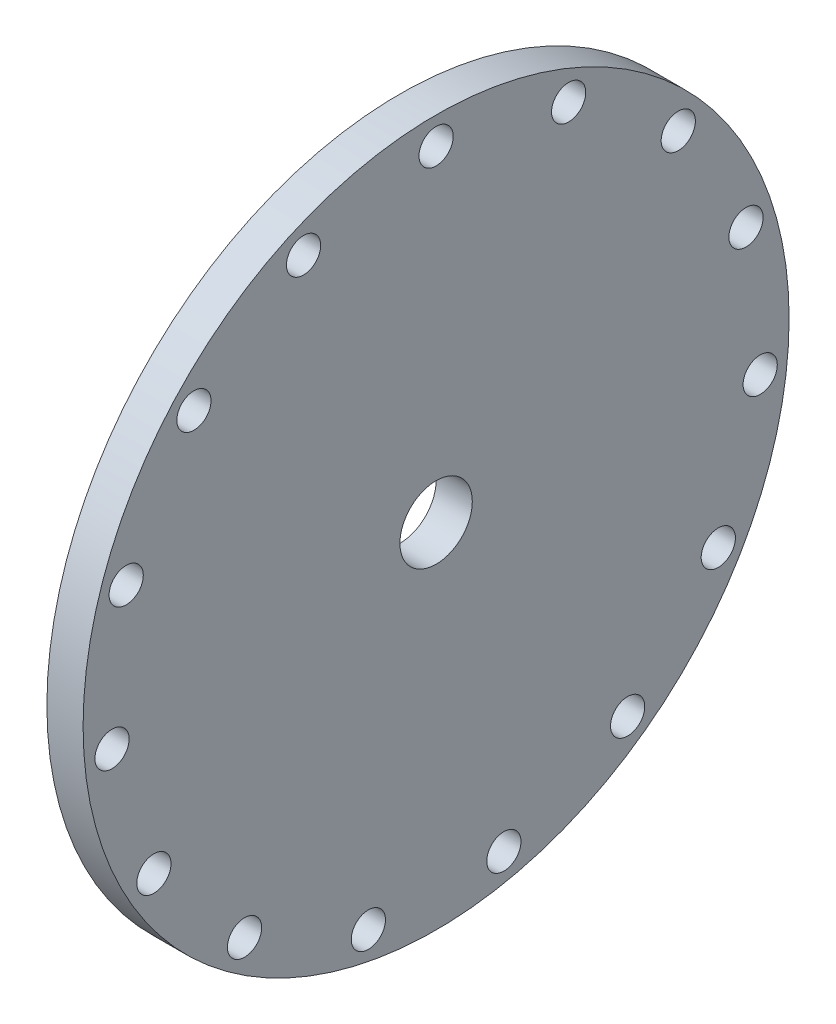
ISO-10303-21;
HEADER;
FILE_DESCRIPTION(('STEP AP214'),'2;1');
FILE_NAME('part.step','',(''),(''),'','','');
FILE_SCHEMA(('AUTOMOTIVE_DESIGN { 1 0 10303 214 1 1 1 1 }'));
ENDSEC;
DATA;
#1=APPLICATION_CONTEXT('core data for automotive mechanical design processes');
#2=APPLICATION_PROTOCOL_DEFINITION('international standard','automotive_design',2000,#1);
#3=PRODUCT_CONTEXT('',#1,'mechanical');
#4=PRODUCT('Part','Part','',(#3));
#5=PRODUCT_RELATED_PRODUCT_CATEGORY('part','',(#4));
#6=PRODUCT_DEFINITION_FORMATION('','',#4);
#7=PRODUCT_DEFINITION_CONTEXT('part definition',#1,'design');
#8=PRODUCT_DEFINITION('design','',#6,#7);
#9=PRODUCT_DEFINITION_SHAPE('','',#8);
#10=(LENGTH_UNIT() NAMED_UNIT(*) SI_UNIT(.MILLI.,.METRE.));
#11=(NAMED_UNIT(*) PLANE_ANGLE_UNIT() SI_UNIT($,.RADIAN.));
#12=(NAMED_UNIT(*) SI_UNIT($,.STERADIAN.) SOLID_ANGLE_UNIT());
#13=UNCERTAINTY_MEASURE_WITH_UNIT(LENGTH_MEASURE(1.E-05),#10,'distance_accuracy_value','');
#14=(GEOMETRIC_REPRESENTATION_CONTEXT(3) GLOBAL_UNCERTAINTY_ASSIGNED_CONTEXT((#13)) GLOBAL_UNIT_ASSIGNED_CONTEXT((#10,
#11,#12)) REPRESENTATION_CONTEXT('',''));
#15=CARTESIAN_POINT('',(0.,0.,0.));
#16=DIRECTION('',(0.,0.,1.));
#17=DIRECTION('',(1.,0.,0.));
#18=AXIS2_PLACEMENT_3D('',#15,#16,#17);
#19=CARTESIAN_POINT('',(3.175,0.,0.));
#20=DIRECTION('',(1.,0.,0.));
#21=DIRECTION('',(0.,0.,-1.));
#22=AXIS2_PLACEMENT_3D('',#19,#20,#21);
#23=PLANE('',#22);
#24=CARTESIAN_POINT('',(3.175,0.,0.));
#25=DIRECTION('',(1.,0.,0.));
#26=DIRECTION('',(0.,0.,-1.));
#27=AXIS2_PLACEMENT_3D('',#24,#25,#26);
#28=CIRCLE('',#27,3.175);
#29=CARTESIAN_POINT('',(3.175,0.,-3.175));
#30=VERTEX_POINT('',#29);
#31=EDGE_CURVE('E150',#30,#30,#28,.T.);
#32=ORIENTED_EDGE('',*,*,#31,.F.);
#33=EDGE_LOOP('',(#32));
#34=FACE_BOUND('',#33,.T.);
#35=CARTESIAN_POINT('',(3.175,19.1204070767037,21.2353633880166));
#36=DIRECTION('',(1.,0.,0.));
#37=DIRECTION('',(0.,0.,-1.));
#38=AXIS2_PLACEMENT_3D('',#35,#36,#37);
#39=CIRCLE('',#38,1.5);
#40=CARTESIAN_POINT('',(3.175,19.1204070767037,19.7353633880166));
#41=VERTEX_POINT('',#40);
#42=EDGE_CURVE('E135',#41,#41,#39,.T.);
#43=ORIENTED_EDGE('',*,*,#42,.F.);
#44=EDGE_LOOP('',(#43));
#45=FACE_BOUND('',#44,.T.);
#46=CARTESIAN_POINT('',(3.175,-2.98690083787389,28.4184631601482));
#47=DIRECTION('',(1.,0.,0.));
#48=DIRECTION('',(0.,0.,-1.));
#49=AXIS2_PLACEMENT_3D('',#46,#47,#48);
#50=CIRCLE('',#49,1.5);
#51=CARTESIAN_POINT('',(3.175,-2.98690083787389,26.9184631601482));
#52=VERTEX_POINT('',#51);
#53=EDGE_CURVE('E123',#52,#52,#50,.T.);
#54=ORIENTED_EDGE('',*,*,#53,.F.);
#55=EDGE_LOOP('',(#54));
#56=FACE_BOUND('',#55,.T.);
#57=CARTESIAN_POINT('',(3.175,-27.9505676909686,5.94107656511645));
#58=DIRECTION('',(1.,0.,0.));
#59=DIRECTION('',(0.,0.,-1.));
#60=AXIS2_PLACEMENT_3D('',#57,#58,#59);
#61=CIRCLE('',#60,1.5);
#62=CARTESIAN_POINT('',(3.175,-27.9505676909686,4.44107656511645));
#63=VERTEX_POINT('',#62);
#64=EDGE_CURVE('E111',#63,#63,#61,.T.);
#65=ORIENTED_EDGE('',*,*,#64,.F.);
#66=EDGE_LOOP('',(#65));
#67=FACE_BOUND('',#66,.T.);
#68=CARTESIAN_POINT('',(3.175,-23.1176606142638,-16.7959635842584));
#69=DIRECTION('',(1.,0.,0.));
#70=DIRECTION('',(0.,0.,-1.));
#71=AXIS2_PLACEMENT_3D('',#68,#69,#70);
#72=CIRCLE('',#71,1.5);
#73=CARTESIAN_POINT('',(3.175,-23.1176606142638,-18.2959635842584));
#74=VERTEX_POINT('',#73);
#75=EDGE_CURVE('E99',#74,#74,#72,.T.);
#76=ORIENTED_EDGE('',*,*,#75,.F.);
#77=EDGE_LOOP('',(#76));
#78=FACE_BOUND('',#77,.T.);
#79=CARTESIAN_POINT('',(3.175,-2.98690083787268,-28.418463160149));
#80=DIRECTION('',(1.,0.,0.));
#81=DIRECTION('',(0.,0.,-1.));
#82=AXIS2_PLACEMENT_3D('',#79,#80,#81);
#83=CIRCLE('',#82,1.5);
#84=CARTESIAN_POINT('',(3.175,-2.98690083787268,-29.918463160149));
#85=VERTEX_POINT('',#84);
#86=EDGE_CURVE('E87',#85,#85,#83,.T.);
#87=ORIENTED_EDGE('',*,*,#86,.F.);
#88=EDGE_LOOP('',(#87));
#89=FACE_BOUND('',#88,.T.);
#90=CARTESIAN_POINT('',(3.175,19.1204070767043,-21.235363388017));
#91=DIRECTION('',(1.,0.,0.));
#92=DIRECTION('',(0.,0.,-1.));
#93=AXIS2_PLACEMENT_3D('',#90,#91,#92);
#94=CIRCLE('',#93,1.5);
#95=CARTESIAN_POINT('',(3.175,19.1204070767043,-22.735363388017));
#96=VERTEX_POINT('',#95);
#97=EDGE_CURVE('E75',#96,#96,#94,.T.);
#98=ORIENTED_EDGE('',*,*,#97,.F.);
#99=EDGE_LOOP('',(#98));
#100=FACE_BOUND('',#99,.T.);
#101=CARTESIAN_POINT('',(3.175,-14.2875000000003,24.7466759131402));
#102=DIRECTION('',(1.,0.,0.));
#103=DIRECTION('',(0.,0.,-1.));
#104=AXIS2_PLACEMENT_3D('',#101,#102,#103);
#105=CIRCLE('',#104,1.5);
#106=CARTESIAN_POINT('',(3.175,-14.2875000000003,23.2466759131402));
#107=VERTEX_POINT('',#106);
#108=EDGE_CURVE('E63',#107,#107,#105,.T.);
#109=ORIENTED_EDGE('',*,*,#108,.F.);
#110=EDGE_LOOP('',(#109));
#111=FACE_BOUND('',#110,.T.);
#112=CARTESIAN_POINT('',(3.175,0.,0.));
#113=DIRECTION('',(1.,0.,0.));
#114=DIRECTION('',(0.,0.,-1.));
#115=AXIS2_PLACEMENT_3D('',#112,#113,#114);
#116=CIRCLE('',#115,30.95625);
#117=CARTESIAN_POINT('',(3.175,0.,-30.95625));
#118=VERTEX_POINT('',#117);
#119=EDGE_CURVE('E12',#118,#118,#116,.T.);
#120=ORIENTED_EDGE('',*,*,#119,.T.);
#121=EDGE_LOOP('',(#120));
#122=FACE_BOUND('',#121,.T.);
#123=CARTESIAN_POINT('',(3.175,28.575,0.));
#124=DIRECTION('',(1.,0.,0.));
#125=DIRECTION('',(0.,0.,-1.));
#126=AXIS2_PLACEMENT_3D('',#123,#124,#125);
#127=CIRCLE('',#126,1.5);
#128=CARTESIAN_POINT('',(3.175,28.575,-1.5));
#129=VERTEX_POINT('',#128);
#130=EDGE_CURVE('E58',#129,#129,#127,.T.);
#131=ORIENTED_EDGE('',*,*,#130,.F.);
#132=EDGE_LOOP('',(#131));
#133=FACE_BOUND('',#132,.T.);
#134=CARTESIAN_POINT('',(3.175,26.1045614521373,-11.6224995758914));
#135=DIRECTION('',(1.,0.,0.));
#136=DIRECTION('',(0.,0.,-1.));
#137=AXIS2_PLACEMENT_3D('',#134,#135,#136);
#138=CIRCLE('',#137,1.5);
#139=CARTESIAN_POINT('',(3.175,26.1045614521373,-13.1224995758914));
#140=VERTEX_POINT('',#139);
#141=EDGE_CURVE('E69',#140,#140,#138,.T.);
#142=ORIENTED_EDGE('',*,*,#141,.F.);
#143=EDGE_LOOP('',(#142));
#144=FACE_BOUND('',#143,.T.);
#145=CARTESIAN_POINT('',(3.175,8.830160614264,-27.1764399531345));
#146=DIRECTION('',(1.,0.,0.));
#147=DIRECTION('',(0.,0.,-1.));
#148=AXIS2_PLACEMENT_3D('',#145,#146,#147);
#149=CIRCLE('',#148,1.5);
#150=CARTESIAN_POINT('',(3.175,8.830160614264,-28.6764399531345));
#151=VERTEX_POINT('',#150);
#152=EDGE_CURVE('E81',#151,#151,#149,.T.);
#153=ORIENTED_EDGE('',*,*,#152,.F.);
#154=EDGE_LOOP('',(#153));
#155=FACE_BOUND('',#154,.T.);
#156=CARTESIAN_POINT('',(3.175,-14.2874999999995,-24.7466759131411));
#157=DIRECTION('',(1.,0.,0.));
#158=DIRECTION('',(0.,0.,-1.));
#159=AXIS2_PLACEMENT_3D('',#156,#157,#158);
#160=CIRCLE('',#159,1.5);
#161=CARTESIAN_POINT('',(3.175,-14.2874999999995,-26.2466759131411));
#162=VERTEX_POINT('',#161);
#163=EDGE_CURVE('E93',#162,#162,#160,.T.);
#164=ORIENTED_EDGE('',*,*,#163,.F.);
#165=EDGE_LOOP('',(#164));
#166=FACE_BOUND('',#165,.T.);
#167=CARTESIAN_POINT('',(3.175,-27.9505676909684,-5.9410765651185));
#168=DIRECTION('',(1.,0.,0.));
#169=DIRECTION('',(0.,0.,-1.));
#170=AXIS2_PLACEMENT_3D('',#167,#168,#169);
#171=CIRCLE('',#170,1.5);
#172=CARTESIAN_POINT('',(3.175,-27.9505676909684,-7.4410765651185));
#173=VERTEX_POINT('',#172);
#174=EDGE_CURVE('E105',#173,#173,#171,.T.);
#175=ORIENTED_EDGE('',*,*,#174,.F.);
#176=EDGE_LOOP('',(#175));
#177=FACE_BOUND('',#176,.T.);
#178=CARTESIAN_POINT('',(3.175,-23.1176606142644,16.7959635842565));
#179=DIRECTION('',(1.,0.,0.));
#180=DIRECTION('',(0.,0.,-1.));
#181=AXIS2_PLACEMENT_3D('',#178,#179,#180);
#182=CIRCLE('',#181,1.5);
#183=CARTESIAN_POINT('',(3.175,-23.1176606142644,15.2959635842565));
#184=VERTEX_POINT('',#183);
#185=EDGE_CURVE('E117',#184,#184,#182,.T.);
#186=ORIENTED_EDGE('',*,*,#185,.F.);
#187=EDGE_LOOP('',(#186));
#188=FACE_BOUND('',#187,.T.);
#189=CARTESIAN_POINT('',(3.175,8.83016061426344,27.1764399531339));
#190=DIRECTION('',(1.,0.,0.));
#191=DIRECTION('',(0.,0.,-1.));
#192=AXIS2_PLACEMENT_3D('',#189,#190,#191);
#193=CIRCLE('',#192,1.5);
#194=CARTESIAN_POINT('',(3.175,8.83016061426344,25.6764399531339));
#195=VERTEX_POINT('',#194);
#196=EDGE_CURVE('E129',#195,#195,#193,.T.);
#197=ORIENTED_EDGE('',*,*,#196,.F.);
#198=EDGE_LOOP('',(#197));
#199=FACE_BOUND('',#198,.T.);
#200=CARTESIAN_POINT('',(3.175,26.1045614521368,11.6224995758911));
#201=DIRECTION('',(1.,0.,0.));
#202=DIRECTION('',(0.,0.,-1.));
#203=AXIS2_PLACEMENT_3D('',#200,#201,#202);
#204=CIRCLE('',#203,1.5);
#205=CARTESIAN_POINT('',(3.175,26.1045614521368,10.1224995758911));
#206=VERTEX_POINT('',#205);
#207=EDGE_CURVE('E141',#206,#206,#204,.T.);
#208=ORIENTED_EDGE('',*,*,#207,.F.);
#209=EDGE_LOOP('',(#208));
#210=FACE_BOUND('',#209,.T.);
#211=ADVANCED_FACE('F47',(#34,#45,#56,#67,#78,#89,#100,#111,#122,#133,#144,#155,#166,#177,#188,
#199,#210),#23,.T.);
#212=CARTESIAN_POINT('',(0.,0.,0.));
#213=DIRECTION('',(1.,0.,0.));
#214=DIRECTION('',(0.,0.,-1.));
#215=AXIS2_PLACEMENT_3D('',#212,#213,#214);
#216=PLANE('',#215);
#217=CARTESIAN_POINT('',(0.,0.,0.));
#218=DIRECTION('',(1.,0.,0.));
#219=DIRECTION('',(0.,0.,-1.));
#220=AXIS2_PLACEMENT_3D('',#217,#218,#219);
#221=CIRCLE('',#220,3.175);
#222=CARTESIAN_POINT('',(0.,0.,-3.175));
#223=VERTEX_POINT('',#222);
#224=EDGE_CURVE('E147',#223,#223,#221,.T.);
#225=ORIENTED_EDGE('',*,*,#224,.T.);
#226=EDGE_LOOP('',(#225));
#227=FACE_BOUND('',#226,.T.);
#228=CARTESIAN_POINT('',(0.,0.,0.));
#229=DIRECTION('',(1.,0.,0.));
#230=DIRECTION('',(0.,0.,-1.));
#231=AXIS2_PLACEMENT_3D('',#228,#229,#230);
#232=CIRCLE('',#231,30.95625);
#233=CARTESIAN_POINT('',(0.,0.,-30.95625));
#234=VERTEX_POINT('',#233);
#235=EDGE_CURVE('E51',#234,#234,#232,.T.);
#236=ORIENTED_EDGE('',*,*,#235,.F.);
#237=EDGE_LOOP('',(#236));
#238=FACE_BOUND('',#237,.T.);
#239=CARTESIAN_POINT('',(0.,28.575,0.));
#240=DIRECTION('',(1.,0.,0.));
#241=DIRECTION('',(0.,0.,-1.));
#242=AXIS2_PLACEMENT_3D('',#239,#240,#241);
#243=CIRCLE('',#242,1.5);
#244=CARTESIAN_POINT('',(0.,28.575,-1.5));
#245=VERTEX_POINT('',#244);
#246=EDGE_CURVE('E60',#245,#245,#243,.T.);
#247=ORIENTED_EDGE('',*,*,#246,.T.);
#248=EDGE_LOOP('',(#247));
#249=FACE_BOUND('',#248,.T.);
#250=CARTESIAN_POINT('',(0.,-14.2875000000003,24.7466759131402));
#251=DIRECTION('',(1.,0.,0.));
#252=DIRECTION('',(0.,0.,-1.));
#253=AXIS2_PLACEMENT_3D('',#250,#251,#252);
#254=CIRCLE('',#253,1.5);
#255=CARTESIAN_POINT('',(0.,-14.2875000000003,23.2466759131402));
#256=VERTEX_POINT('',#255);
#257=EDGE_CURVE('E66',#256,#256,#254,.T.);
#258=ORIENTED_EDGE('',*,*,#257,.T.);
#259=EDGE_LOOP('',(#258));
#260=FACE_BOUND('',#259,.T.);
#261=CARTESIAN_POINT('',(0.,26.1045614521373,-11.6224995758914));
#262=DIRECTION('',(1.,0.,0.));
#263=DIRECTION('',(0.,0.,-1.));
#264=AXIS2_PLACEMENT_3D('',#261,#262,#263);
#265=CIRCLE('',#264,1.5);
#266=CARTESIAN_POINT('',(0.,26.1045614521373,-13.1224995758914));
#267=VERTEX_POINT('',#266);
#268=EDGE_CURVE('E72',#267,#267,#265,.T.);
#269=ORIENTED_EDGE('',*,*,#268,.T.);
#270=EDGE_LOOP('',(#269));
#271=FACE_BOUND('',#270,.T.);
#272=CARTESIAN_POINT('',(0.,19.1204070767043,-21.235363388017));
#273=DIRECTION('',(1.,0.,0.));
#274=DIRECTION('',(0.,0.,-1.));
#275=AXIS2_PLACEMENT_3D('',#272,#273,#274);
#276=CIRCLE('',#275,1.5);
#277=CARTESIAN_POINT('',(0.,19.1204070767043,-22.735363388017));
#278=VERTEX_POINT('',#277);
#279=EDGE_CURVE('E78',#278,#278,#276,.T.);
#280=ORIENTED_EDGE('',*,*,#279,.T.);
#281=EDGE_LOOP('',(#280));
#282=FACE_BOUND('',#281,.T.);
#283=CARTESIAN_POINT('',(0.,8.830160614264,-27.1764399531345));
#284=DIRECTION('',(1.,0.,0.));
#285=DIRECTION('',(0.,0.,-1.));
#286=AXIS2_PLACEMENT_3D('',#283,#284,#285);
#287=CIRCLE('',#286,1.5);
#288=CARTESIAN_POINT('',(0.,8.830160614264,-28.6764399531345));
#289=VERTEX_POINT('',#288);
#290=EDGE_CURVE('E84',#289,#289,#287,.T.);
#291=ORIENTED_EDGE('',*,*,#290,.T.);
#292=EDGE_LOOP('',(#291));
#293=FACE_BOUND('',#292,.T.);
#294=CARTESIAN_POINT('',(0.,-2.98690083787268,-28.418463160149));
#295=DIRECTION('',(1.,0.,0.));
#296=DIRECTION('',(0.,0.,-1.));
#297=AXIS2_PLACEMENT_3D('',#294,#295,#296);
#298=CIRCLE('',#297,1.5);
#299=CARTESIAN_POINT('',(0.,-2.98690083787268,-29.918463160149));
#300=VERTEX_POINT('',#299);
#301=EDGE_CURVE('E90',#300,#300,#298,.T.);
#302=ORIENTED_EDGE('',*,*,#301,.T.);
#303=EDGE_LOOP('',(#302));
#304=FACE_BOUND('',#303,.T.);
#305=CARTESIAN_POINT('',(0.,-14.2874999999995,-24.7466759131411));
#306=DIRECTION('',(1.,0.,0.));
#307=DIRECTION('',(0.,0.,-1.));
#308=AXIS2_PLACEMENT_3D('',#305,#306,#307);
#309=CIRCLE('',#308,1.5);
#310=CARTESIAN_POINT('',(0.,-14.2874999999995,-26.2466759131411));
#311=VERTEX_POINT('',#310);
#312=EDGE_CURVE('E96',#311,#311,#309,.T.);
#313=ORIENTED_EDGE('',*,*,#312,.T.);
#314=EDGE_LOOP('',(#313));
#315=FACE_BOUND('',#314,.T.);
#316=CARTESIAN_POINT('',(0.,-23.1176606142638,-16.7959635842584));
#317=DIRECTION('',(1.,0.,0.));
#318=DIRECTION('',(0.,0.,-1.));
#319=AXIS2_PLACEMENT_3D('',#316,#317,#318);
#320=CIRCLE('',#319,1.5);
#321=CARTESIAN_POINT('',(0.,-23.1176606142638,-18.2959635842584));
#322=VERTEX_POINT('',#321);
#323=EDGE_CURVE('E102',#322,#322,#320,.T.);
#324=ORIENTED_EDGE('',*,*,#323,.T.);
#325=EDGE_LOOP('',(#324));
#326=FACE_BOUND('',#325,.T.);
#327=CARTESIAN_POINT('',(0.,-27.9505676909684,-5.9410765651185));
#328=DIRECTION('',(1.,0.,0.));
#329=DIRECTION('',(0.,0.,-1.));
#330=AXIS2_PLACEMENT_3D('',#327,#328,#329);
#331=CIRCLE('',#330,1.5);
#332=CARTESIAN_POINT('',(0.,-27.9505676909684,-7.4410765651185));
#333=VERTEX_POINT('',#332);
#334=EDGE_CURVE('E108',#333,#333,#331,.T.);
#335=ORIENTED_EDGE('',*,*,#334,.T.);
#336=EDGE_LOOP('',(#335));
#337=FACE_BOUND('',#336,.T.);
#338=CARTESIAN_POINT('',(0.,-27.9505676909686,5.94107656511645));
#339=DIRECTION('',(1.,0.,0.));
#340=DIRECTION('',(0.,0.,-1.));
#341=AXIS2_PLACEMENT_3D('',#338,#339,#340);
#342=CIRCLE('',#341,1.5);
#343=CARTESIAN_POINT('',(0.,-27.9505676909686,4.44107656511645));
#344=VERTEX_POINT('',#343);
#345=EDGE_CURVE('E114',#344,#344,#342,.T.);
#346=ORIENTED_EDGE('',*,*,#345,.T.);
#347=EDGE_LOOP('',(#346));
#348=FACE_BOUND('',#347,.T.);
#349=CARTESIAN_POINT('',(0.,-23.1176606142644,16.7959635842565));
#350=DIRECTION('',(1.,0.,0.));
#351=DIRECTION('',(0.,0.,-1.));
#352=AXIS2_PLACEMENT_3D('',#349,#350,#351);
#353=CIRCLE('',#352,1.5);
#354=CARTESIAN_POINT('',(0.,-23.1176606142644,15.2959635842565));
#355=VERTEX_POINT('',#354);
#356=EDGE_CURVE('E120',#355,#355,#353,.T.);
#357=ORIENTED_EDGE('',*,*,#356,.T.);
#358=EDGE_LOOP('',(#357));
#359=FACE_BOUND('',#358,.T.);
#360=CARTESIAN_POINT('',(0.,-2.98690083787389,28.4184631601482));
#361=DIRECTION('',(1.,0.,0.));
#362=DIRECTION('',(0.,0.,-1.));
#363=AXIS2_PLACEMENT_3D('',#360,#361,#362);
#364=CIRCLE('',#363,1.5);
#365=CARTESIAN_POINT('',(0.,-2.98690083787389,26.9184631601482));
#366=VERTEX_POINT('',#365);
#367=EDGE_CURVE('E126',#366,#366,#364,.T.);
#368=ORIENTED_EDGE('',*,*,#367,.T.);
#369=EDGE_LOOP('',(#368));
#370=FACE_BOUND('',#369,.T.);
#371=CARTESIAN_POINT('',(0.,8.83016061426344,27.1764399531339));
#372=DIRECTION('',(1.,0.,0.));
#373=DIRECTION('',(0.,0.,-1.));
#374=AXIS2_PLACEMENT_3D('',#371,#372,#373);
#375=CIRCLE('',#374,1.5);
#376=CARTESIAN_POINT('',(0.,8.83016061426344,25.6764399531339));
#377=VERTEX_POINT('',#376);
#378=EDGE_CURVE('E132',#377,#377,#375,.T.);
#379=ORIENTED_EDGE('',*,*,#378,.T.);
#380=EDGE_LOOP('',(#379));
#381=FACE_BOUND('',#380,.T.);
#382=CARTESIAN_POINT('',(0.,19.1204070767037,21.2353633880166));
#383=DIRECTION('',(1.,0.,0.));
#384=DIRECTION('',(0.,0.,-1.));
#385=AXIS2_PLACEMENT_3D('',#382,#383,#384);
#386=CIRCLE('',#385,1.5);
#387=CARTESIAN_POINT('',(0.,19.1204070767037,19.7353633880166));
#388=VERTEX_POINT('',#387);
#389=EDGE_CURVE('E138',#388,#388,#386,.T.);
#390=ORIENTED_EDGE('',*,*,#389,.T.);
#391=EDGE_LOOP('',(#390));
#392=FACE_BOUND('',#391,.T.);
#393=CARTESIAN_POINT('',(0.,26.1045614521368,11.6224995758911));
#394=DIRECTION('',(1.,0.,0.));
#395=DIRECTION('',(0.,0.,-1.));
#396=AXIS2_PLACEMENT_3D('',#393,#394,#395);
#397=CIRCLE('',#396,1.5);
#398=CARTESIAN_POINT('',(0.,26.1045614521368,10.1224995758911));
#399=VERTEX_POINT('',#398);
#400=EDGE_CURVE('E144',#399,#399,#397,.T.);
#401=ORIENTED_EDGE('',*,*,#400,.T.);
#402=EDGE_LOOP('',(#401));
#403=FACE_BOUND('',#402,.T.);
#404=ADVANCED_FACE('F156',(#227,#238,#249,#260,#271,#282,#293,#304,#315,#326,#337,#348,#359,
#370,#381,#392,#403),#216,.F.);
#405=CARTESIAN_POINT('',(3.175,0.,0.));
#406=DIRECTION('',(-1.,0.,0.));
#407=DIRECTION('',(0.,0.,1.));
#408=AXIS2_PLACEMENT_3D('',#405,#406,#407);
#409=CYLINDRICAL_SURFACE('',#408,30.95625);
#410=ORIENTED_EDGE('',*,*,#119,.F.);
#411=EDGE_LOOP('',(#410));
#412=FACE_BOUND('',#411,.T.);
#413=ORIENTED_EDGE('',*,*,#235,.T.);
#414=EDGE_LOOP('',(#413));
#415=FACE_BOUND('',#414,.T.);
#416=ADVANCED_FACE('F49',(#412,#415),#409,.T.);
#417=CARTESIAN_POINT('',(3.175,28.575,0.));
#418=DIRECTION('',(-1.,0.,0.));
#419=DIRECTION('',(0.,0.,1.));
#420=AXIS2_PLACEMENT_3D('',#417,#418,#419);
#421=CYLINDRICAL_SURFACE('',#420,1.5);
#422=ORIENTED_EDGE('',*,*,#130,.T.);
#423=EDGE_LOOP('',(#422));
#424=FACE_BOUND('',#423,.T.);
#425=ORIENTED_EDGE('',*,*,#246,.F.);
#426=EDGE_LOOP('',(#425));
#427=FACE_BOUND('',#426,.T.);
#428=ADVANCED_FACE('F209',(#424,#427),#421,.F.);
#429=CARTESIAN_POINT('',(3.175,-14.2875000000003,24.7466759131402));
#430=DIRECTION('',(-1.,0.,0.));
#431=DIRECTION('',(0.,0.,1.));
#432=AXIS2_PLACEMENT_3D('',#429,#430,#431);
#433=CYLINDRICAL_SURFACE('',#432,1.5);
#434=ORIENTED_EDGE('',*,*,#108,.T.);
#435=EDGE_LOOP('',(#434));
#436=FACE_BOUND('',#435,.T.);
#437=ORIENTED_EDGE('',*,*,#257,.F.);
#438=EDGE_LOOP('',(#437));
#439=FACE_BOUND('',#438,.T.);
#440=ADVANCED_FACE('F214',(#436,#439),#433,.F.);
#441=CARTESIAN_POINT('',(3.175,26.1045614521373,-11.6224995758914));
#442=DIRECTION('',(-1.,0.,0.));
#443=DIRECTION('',(0.,0.,1.));
#444=AXIS2_PLACEMENT_3D('',#441,#442,#443);
#445=CYLINDRICAL_SURFACE('',#444,1.5);
#446=ORIENTED_EDGE('',*,*,#141,.T.);
#447=EDGE_LOOP('',(#446));
#448=FACE_BOUND('',#447,.T.);
#449=ORIENTED_EDGE('',*,*,#268,.F.);
#450=EDGE_LOOP('',(#449));
#451=FACE_BOUND('',#450,.T.);
#452=ADVANCED_FACE('F218',(#448,#451),#445,.F.);
#453=CARTESIAN_POINT('',(3.175,19.1204070767043,-21.235363388017));
#454=DIRECTION('',(-1.,0.,0.));
#455=DIRECTION('',(0.,0.,1.));
#456=AXIS2_PLACEMENT_3D('',#453,#454,#455);
#457=CYLINDRICAL_SURFACE('',#456,1.5);
#458=ORIENTED_EDGE('',*,*,#97,.T.);
#459=EDGE_LOOP('',(#458));
#460=FACE_BOUND('',#459,.T.);
#461=ORIENTED_EDGE('',*,*,#279,.F.);
#462=EDGE_LOOP('',(#461));
#463=FACE_BOUND('',#462,.T.);
#464=ADVANCED_FACE('F222',(#460,#463),#457,.F.);
#465=CARTESIAN_POINT('',(3.175,8.830160614264,-27.1764399531345));
#466=DIRECTION('',(-1.,0.,0.));
#467=DIRECTION('',(0.,0.,1.));
#468=AXIS2_PLACEMENT_3D('',#465,#466,#467);
#469=CYLINDRICAL_SURFACE('',#468,1.5);
#470=ORIENTED_EDGE('',*,*,#152,.T.);
#471=EDGE_LOOP('',(#470));
#472=FACE_BOUND('',#471,.T.);
#473=ORIENTED_EDGE('',*,*,#290,.F.);
#474=EDGE_LOOP('',(#473));
#475=FACE_BOUND('',#474,.T.);
#476=ADVANCED_FACE('F226',(#472,#475),#469,.F.);
#477=CARTESIAN_POINT('',(3.175,-2.98690083787268,-28.418463160149));
#478=DIRECTION('',(-1.,0.,0.));
#479=DIRECTION('',(0.,0.,1.));
#480=AXIS2_PLACEMENT_3D('',#477,#478,#479);
#481=CYLINDRICAL_SURFACE('',#480,1.5);
#482=ORIENTED_EDGE('',*,*,#86,.T.);
#483=EDGE_LOOP('',(#482));
#484=FACE_BOUND('',#483,.T.);
#485=ORIENTED_EDGE('',*,*,#301,.F.);
#486=EDGE_LOOP('',(#485));
#487=FACE_BOUND('',#486,.T.);
#488=ADVANCED_FACE('F230',(#484,#487),#481,.F.);
#489=CARTESIAN_POINT('',(3.175,-14.2874999999995,-24.7466759131411));
#490=DIRECTION('',(-1.,0.,0.));
#491=DIRECTION('',(0.,0.,1.));
#492=AXIS2_PLACEMENT_3D('',#489,#490,#491);
#493=CYLINDRICAL_SURFACE('',#492,1.5);
#494=ORIENTED_EDGE('',*,*,#163,.T.);
#495=EDGE_LOOP('',(#494));
#496=FACE_BOUND('',#495,.T.);
#497=ORIENTED_EDGE('',*,*,#312,.F.);
#498=EDGE_LOOP('',(#497));
#499=FACE_BOUND('',#498,.T.);
#500=ADVANCED_FACE('F234',(#496,#499),#493,.F.);
#501=CARTESIAN_POINT('',(3.175,-23.1176606142638,-16.7959635842584));
#502=DIRECTION('',(-1.,0.,0.));
#503=DIRECTION('',(0.,0.,1.));
#504=AXIS2_PLACEMENT_3D('',#501,#502,#503);
#505=CYLINDRICAL_SURFACE('',#504,1.5);
#506=ORIENTED_EDGE('',*,*,#75,.T.);
#507=EDGE_LOOP('',(#506));
#508=FACE_BOUND('',#507,.T.);
#509=ORIENTED_EDGE('',*,*,#323,.F.);
#510=EDGE_LOOP('',(#509));
#511=FACE_BOUND('',#510,.T.);
#512=ADVANCED_FACE('F238',(#508,#511),#505,.F.);
#513=CARTESIAN_POINT('',(3.175,-27.9505676909684,-5.9410765651185));
#514=DIRECTION('',(-1.,0.,0.));
#515=DIRECTION('',(0.,0.,1.));
#516=AXIS2_PLACEMENT_3D('',#513,#514,#515);
#517=CYLINDRICAL_SURFACE('',#516,1.5);
#518=ORIENTED_EDGE('',*,*,#174,.T.);
#519=EDGE_LOOP('',(#518));
#520=FACE_BOUND('',#519,.T.);
#521=ORIENTED_EDGE('',*,*,#334,.F.);
#522=EDGE_LOOP('',(#521));
#523=FACE_BOUND('',#522,.T.);
#524=ADVANCED_FACE('F242',(#520,#523),#517,.F.);
#525=CARTESIAN_POINT('',(3.175,-27.9505676909686,5.94107656511645));
#526=DIRECTION('',(-1.,0.,0.));
#527=DIRECTION('',(0.,0.,1.));
#528=AXIS2_PLACEMENT_3D('',#525,#526,#527);
#529=CYLINDRICAL_SURFACE('',#528,1.5);
#530=ORIENTED_EDGE('',*,*,#64,.T.);
#531=EDGE_LOOP('',(#530));
#532=FACE_BOUND('',#531,.T.);
#533=ORIENTED_EDGE('',*,*,#345,.F.);
#534=EDGE_LOOP('',(#533));
#535=FACE_BOUND('',#534,.T.);
#536=ADVANCED_FACE('F246',(#532,#535),#529,.F.);
#537=CARTESIAN_POINT('',(3.175,-23.1176606142644,16.7959635842565));
#538=DIRECTION('',(-1.,0.,0.));
#539=DIRECTION('',(0.,0.,1.));
#540=AXIS2_PLACEMENT_3D('',#537,#538,#539);
#541=CYLINDRICAL_SURFACE('',#540,1.5);
#542=ORIENTED_EDGE('',*,*,#185,.T.);
#543=EDGE_LOOP('',(#542));
#544=FACE_BOUND('',#543,.T.);
#545=ORIENTED_EDGE('',*,*,#356,.F.);
#546=EDGE_LOOP('',(#545));
#547=FACE_BOUND('',#546,.T.);
#548=ADVANCED_FACE('F250',(#544,#547),#541,.F.);
#549=CARTESIAN_POINT('',(3.175,-2.98690083787389,28.4184631601482));
#550=DIRECTION('',(-1.,0.,0.));
#551=DIRECTION('',(0.,0.,1.));
#552=AXIS2_PLACEMENT_3D('',#549,#550,#551);
#553=CYLINDRICAL_SURFACE('',#552,1.5);
#554=ORIENTED_EDGE('',*,*,#53,.T.);
#555=EDGE_LOOP('',(#554));
#556=FACE_BOUND('',#555,.T.);
#557=ORIENTED_EDGE('',*,*,#367,.F.);
#558=EDGE_LOOP('',(#557));
#559=FACE_BOUND('',#558,.T.);
#560=ADVANCED_FACE('F254',(#556,#559),#553,.F.);
#561=CARTESIAN_POINT('',(3.175,8.83016061426344,27.1764399531339));
#562=DIRECTION('',(-1.,0.,0.));
#563=DIRECTION('',(0.,0.,1.));
#564=AXIS2_PLACEMENT_3D('',#561,#562,#563);
#565=CYLINDRICAL_SURFACE('',#564,1.5);
#566=ORIENTED_EDGE('',*,*,#196,.T.);
#567=EDGE_LOOP('',(#566));
#568=FACE_BOUND('',#567,.T.);
#569=ORIENTED_EDGE('',*,*,#378,.F.);
#570=EDGE_LOOP('',(#569));
#571=FACE_BOUND('',#570,.T.);
#572=ADVANCED_FACE('F258',(#568,#571),#565,.F.);
#573=CARTESIAN_POINT('',(3.175,19.1204070767037,21.2353633880166));
#574=DIRECTION('',(-1.,0.,0.));
#575=DIRECTION('',(0.,0.,1.));
#576=AXIS2_PLACEMENT_3D('',#573,#574,#575);
#577=CYLINDRICAL_SURFACE('',#576,1.5);
#578=ORIENTED_EDGE('',*,*,#42,.T.);
#579=EDGE_LOOP('',(#578));
#580=FACE_BOUND('',#579,.T.);
#581=ORIENTED_EDGE('',*,*,#389,.F.);
#582=EDGE_LOOP('',(#581));
#583=FACE_BOUND('',#582,.T.);
#584=ADVANCED_FACE('F201',(#580,#583),#577,.F.);
#585=CARTESIAN_POINT('',(3.175,26.1045614521368,11.6224995758911));
#586=DIRECTION('',(-1.,0.,0.));
#587=DIRECTION('',(0.,0.,1.));
#588=AXIS2_PLACEMENT_3D('',#585,#586,#587);
#589=CYLINDRICAL_SURFACE('',#588,1.5);
#590=ORIENTED_EDGE('',*,*,#207,.T.);
#591=EDGE_LOOP('',(#590));
#592=FACE_BOUND('',#591,.T.);
#593=ORIENTED_EDGE('',*,*,#400,.F.);
#594=EDGE_LOOP('',(#593));
#595=FACE_BOUND('',#594,.T.);
#596=ADVANCED_FACE('F162',(#592,#595),#589,.F.);
#597=CARTESIAN_POINT('',(0.,0.,0.));
#598=DIRECTION('',(1.,0.,0.));
#599=DIRECTION('',(0.,0.,-1.));
#600=AXIS2_PLACEMENT_3D('',#597,#598,#599);
#601=CYLINDRICAL_SURFACE('',#600,3.175);
#602=ORIENTED_EDGE('',*,*,#224,.F.);
#603=EDGE_LOOP('',(#602));
#604=FACE_BOUND('',#603,.T.);
#605=ORIENTED_EDGE('',*,*,#31,.T.);
#606=EDGE_LOOP('',(#605));
#607=FACE_BOUND('',#606,.T.);
#608=ADVANCED_FACE('F159',(#604,#607),#601,.F.);
#609=CLOSED_SHELL('',(#211,#404,#416,#428,#440,#452,#464,#476,#488,#500,#512,#524,#536,#548,
#560,#572,#584,#596,#608));
#610=MANIFOLD_SOLID_BREP('B2',#609);
#611=ADVANCED_BREP_SHAPE_REPRESENTATION('',(#18,#610),#14);
#612=SHAPE_DEFINITION_REPRESENTATION(#9,#611);
ENDSEC;
END-ISO-10303-21;
